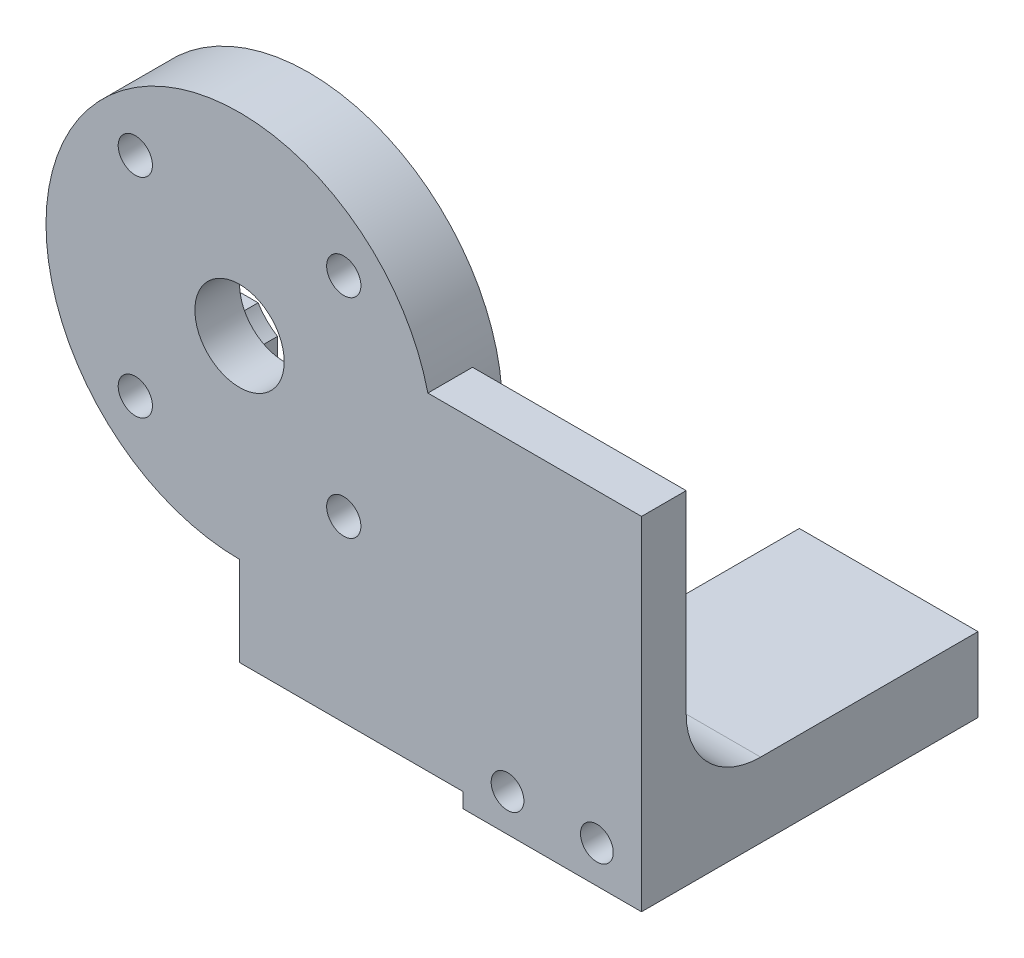
ISO-10303-21;
HEADER;
FILE_DESCRIPTION(('STEP AP214'),'2;1');
FILE_NAME('part.step','',(''),(''),'','','');
FILE_SCHEMA(('AUTOMOTIVE_DESIGN { 1 0 10303 214 1 1 1 1 }'));
ENDSEC;
DATA;
#1=APPLICATION_CONTEXT('core data for automotive mechanical design processes');
#2=APPLICATION_PROTOCOL_DEFINITION('international standard','automotive_design',2000,#1);
#3=PRODUCT_CONTEXT('',#1,'mechanical');
#4=PRODUCT('Part','Part','',(#3));
#5=PRODUCT_RELATED_PRODUCT_CATEGORY('part','',(#4));
#6=PRODUCT_DEFINITION_FORMATION('','',#4);
#7=PRODUCT_DEFINITION_CONTEXT('part definition',#1,'design');
#8=PRODUCT_DEFINITION('design','',#6,#7);
#9=PRODUCT_DEFINITION_SHAPE('','',#8);
#10=(LENGTH_UNIT() NAMED_UNIT(*) SI_UNIT(.MILLI.,.METRE.));
#11=(NAMED_UNIT(*) PLANE_ANGLE_UNIT() SI_UNIT($,.RADIAN.));
#12=(NAMED_UNIT(*) SI_UNIT($,.STERADIAN.) SOLID_ANGLE_UNIT());
#13=UNCERTAINTY_MEASURE_WITH_UNIT(LENGTH_MEASURE(1.E-05),#10,'distance_accuracy_value','');
#14=(GEOMETRIC_REPRESENTATION_CONTEXT(3) GLOBAL_UNCERTAINTY_ASSIGNED_CONTEXT((#13)) GLOBAL_UNIT_ASSIGNED_CONTEXT((#10,
#11,#12)) REPRESENTATION_CONTEXT('',''));
#15=CARTESIAN_POINT('',(0.,0.,0.));
#16=DIRECTION('',(0.,0.,1.));
#17=DIRECTION('',(1.,0.,0.));
#18=AXIS2_PLACEMENT_3D('',#15,#16,#17);
#19=CARTESIAN_POINT('',(0.,0.,17.95));
#20=DIRECTION('',(0.,0.,1.));
#21=DIRECTION('',(1.,0.,0.));
#22=AXIS2_PLACEMENT_3D('',#19,#20,#21);
#23=PLANE('',#22);
#24=CARTESIAN_POINT('',(7.,-7.,17.95));
#25=DIRECTION('',(0.,0.,1.));
#26=DIRECTION('',(1.,0.,0.));
#27=AXIS2_PLACEMENT_3D('',#24,#25,#26);
#28=CIRCLE('',#27,1.15);
#29=CARTESIAN_POINT('',(8.15,-7.,17.95));
#30=VERTEX_POINT('',#29);
#31=EDGE_CURVE('E786',#30,#30,#28,.F.);
#32=ORIENTED_EDGE('',*,*,#31,.F.);
#33=EDGE_LOOP('',(#32));
#34=FACE_BOUND('',#33,.T.);
#35=CARTESIAN_POINT('',(-7.,-7.,17.95));
#36=DIRECTION('',(0.,0.,1.));
#37=DIRECTION('',(1.,0.,0.));
#38=AXIS2_PLACEMENT_3D('',#35,#36,#37);
#39=CIRCLE('',#38,1.15);
#40=CARTESIAN_POINT('',(-5.85,-7.,17.95));
#41=VERTEX_POINT('',#40);
#42=EDGE_CURVE('E785',#41,#41,#39,.F.);
#43=ORIENTED_EDGE('',*,*,#42,.F.);
#44=EDGE_LOOP('',(#43));
#45=FACE_BOUND('',#44,.T.);
#46=CARTESIAN_POINT('',(-7.,7.,17.95));
#47=DIRECTION('',(0.,0.,1.));
#48=DIRECTION('',(1.,0.,0.));
#49=AXIS2_PLACEMENT_3D('',#46,#47,#48);
#50=CIRCLE('',#49,1.15);
#51=CARTESIAN_POINT('',(-5.85,7.,17.95));
#52=VERTEX_POINT('',#51);
#53=EDGE_CURVE('E773',#52,#52,#50,.F.);
#54=ORIENTED_EDGE('',*,*,#53,.F.);
#55=EDGE_LOOP('',(#54));
#56=FACE_BOUND('',#55,.T.);
#57=CARTESIAN_POINT('',(7.,7.,17.95));
#58=DIRECTION('',(0.,0.,1.));
#59=DIRECTION('',(1.,0.,0.));
#60=AXIS2_PLACEMENT_3D('',#57,#58,#59);
#61=CIRCLE('',#60,1.15);
#62=CARTESIAN_POINT('',(8.15,7.,17.95));
#63=VERTEX_POINT('',#62);
#64=EDGE_CURVE('E775',#63,#63,#61,.F.);
#65=ORIENTED_EDGE('',*,*,#64,.F.);
#66=EDGE_LOOP('',(#65));
#67=FACE_BOUND('',#66,.T.);
#68=CARTESIAN_POINT('',(0.,0.,17.95));
#69=DIRECTION('',(0.,0.,1.));
#70=DIRECTION('',(1.,0.,0.));
#71=AXIS2_PLACEMENT_3D('',#68,#69,#70);
#72=CIRCLE('',#71,13.);
#73=CARTESIAN_POINT('',(13.,0.,17.95));
#74=VERTEX_POINT('',#73);
#75=EDGE_CURVE('E266',#74,#74,#72,.T.);
#76=ORIENTED_EDGE('',*,*,#75,.F.);
#77=EDGE_LOOP('',(#76));
#78=FACE_BOUND('',#77,.T.);
#79=DIRECTION('',(-1.,0.,0.));
#80=VECTOR('',#79,1.);
#81=CARTESIAN_POINT('',(-8.15,2.1,17.95));
#82=LINE('',#81,#80);
#83=CARTESIAN_POINT('',(8.15,2.1,17.95));
#84=VERTEX_POINT('',#83);
#85=CARTESIAN_POINT('',(3.40440890610984,2.1,17.95));
#86=VERTEX_POINT('',#85);
#87=EDGE_CURVE('E234',#84,#86,#82,.T.);
#88=ORIENTED_EDGE('',*,*,#87,.T.);
#89=CARTESIAN_POINT('',(0.,0.,17.95));
#90=DIRECTION('',(0.,0.,1.));
#91=DIRECTION('',(1.,0.,0.));
#92=AXIS2_PLACEMENT_3D('',#89,#90,#91);
#93=CIRCLE('',#92,4.);
#94=CARTESIAN_POINT('',(2.1,3.40440890610984,17.95));
#95=VERTEX_POINT('',#94);
#96=EDGE_CURVE('E212',#86,#95,#93,.T.);
#97=ORIENTED_EDGE('',*,*,#96,.T.);
#98=DIRECTION('',(0.,1.,0.));
#99=VECTOR('',#98,1.);
#100=CARTESIAN_POINT('',(2.1,-8.15,17.95));
#101=LINE('',#100,#99);
#102=CARTESIAN_POINT('',(2.1,8.15,17.95));
#103=VERTEX_POINT('',#102);
#104=EDGE_CURVE('E817',#95,#103,#101,.T.);
#105=ORIENTED_EDGE('',*,*,#104,.T.);
#106=CARTESIAN_POINT('',(0.,8.15,17.95));
#107=DIRECTION('',(0.,0.,1.));
#108=DIRECTION('',(1.,0.,0.));
#109=AXIS2_PLACEMENT_3D('',#106,#107,#108);
#110=CIRCLE('',#109,2.1);
#111=CARTESIAN_POINT('',(-2.1,8.15,17.95));
#112=VERTEX_POINT('',#111);
#113=EDGE_CURVE('E799',#103,#112,#110,.T.);
#114=ORIENTED_EDGE('',*,*,#113,.T.);
#115=DIRECTION('',(0.,-1.,0.));
#116=VECTOR('',#115,1.);
#117=CARTESIAN_POINT('',(-2.1,-8.15,17.95));
#118=LINE('',#117,#116);
#119=CARTESIAN_POINT('',(-2.1,3.40440890610984,17.95));
#120=VERTEX_POINT('',#119);
#121=EDGE_CURVE('E820',#112,#120,#118,.T.);
#122=ORIENTED_EDGE('',*,*,#121,.T.);
#123=CARTESIAN_POINT('',(-3.40440890610984,2.1,17.95));
#124=VERTEX_POINT('',#123);
#125=EDGE_CURVE('E228',#120,#124,#93,.T.);
#126=ORIENTED_EDGE('',*,*,#125,.T.);
#127=CARTESIAN_POINT('',(-8.15,2.1,17.95));
#128=VERTEX_POINT('',#127);
#129=EDGE_CURVE('E242',#124,#128,#82,.T.);
#130=ORIENTED_EDGE('',*,*,#129,.T.);
#131=CARTESIAN_POINT('',(-8.15,0.,17.95));
#132=DIRECTION('',(0.,0.,1.));
#133=DIRECTION('',(1.,0.,0.));
#134=AXIS2_PLACEMENT_3D('',#131,#132,#133);
#135=CIRCLE('',#134,2.1);
#136=CARTESIAN_POINT('',(-8.15,-2.1,17.95));
#137=VERTEX_POINT('',#136);
#138=EDGE_CURVE('E794',#128,#137,#135,.T.);
#139=ORIENTED_EDGE('',*,*,#138,.T.);
#140=DIRECTION('',(1.,0.,0.));
#141=VECTOR('',#140,1.);
#142=CARTESIAN_POINT('',(-8.15,-2.1,17.95));
#143=LINE('',#142,#141);
#144=CARTESIAN_POINT('',(-3.40440890610984,-2.1,17.95));
#145=VERTEX_POINT('',#144);
#146=EDGE_CURVE('E247',#137,#145,#143,.T.);
#147=ORIENTED_EDGE('',*,*,#146,.T.);
#148=CARTESIAN_POINT('',(-2.1,-3.40440890610984,17.95));
#149=VERTEX_POINT('',#148);
#150=EDGE_CURVE('E853',#145,#149,#93,.T.);
#151=ORIENTED_EDGE('',*,*,#150,.T.);
#152=CARTESIAN_POINT('',(-2.1,-8.15,17.95));
#153=VERTEX_POINT('',#152);
#154=EDGE_CURVE('E795',#149,#153,#118,.T.);
#155=ORIENTED_EDGE('',*,*,#154,.T.);
#156=CARTESIAN_POINT('',(0.,-8.15,17.95));
#157=DIRECTION('',(0.,0.,1.));
#158=DIRECTION('',(1.,0.,0.));
#159=AXIS2_PLACEMENT_3D('',#156,#157,#158);
#160=CIRCLE('',#159,2.1);
#161=CARTESIAN_POINT('',(2.1,-8.15,17.95));
#162=VERTEX_POINT('',#161);
#163=EDGE_CURVE('E803',#153,#162,#160,.T.);
#164=ORIENTED_EDGE('',*,*,#163,.T.);
#165=CARTESIAN_POINT('',(2.1,-3.40440890610984,17.95));
#166=VERTEX_POINT('',#165);
#167=EDGE_CURVE('E821',#162,#166,#101,.T.);
#168=ORIENTED_EDGE('',*,*,#167,.T.);
#169=CARTESIAN_POINT('',(3.40440890610984,-2.1,17.95));
#170=VERTEX_POINT('',#169);
#171=EDGE_CURVE('E226',#166,#170,#93,.T.);
#172=ORIENTED_EDGE('',*,*,#171,.T.);
#173=CARTESIAN_POINT('',(8.15,-2.1,17.95));
#174=VERTEX_POINT('',#173);
#175=EDGE_CURVE('E835',#170,#174,#143,.T.);
#176=ORIENTED_EDGE('',*,*,#175,.T.);
#177=CARTESIAN_POINT('',(8.15,0.,17.95));
#178=DIRECTION('',(0.,0.,1.));
#179=DIRECTION('',(1.,0.,0.));
#180=AXIS2_PLACEMENT_3D('',#177,#178,#179);
#181=CIRCLE('',#180,2.1);
#182=EDGE_CURVE('E245',#174,#84,#181,.T.);
#183=ORIENTED_EDGE('',*,*,#182,.T.);
#184=EDGE_LOOP('',(#88,#97,#105,#114,#122,#126,#130,#139,#147,#151,#155,#164,#168,#172,#176,#183));
#185=FACE_BOUND('',#184,.T.);
#186=ADVANCED_FACE('F42',(#34,#45,#56,#67,#78,#185),#23,.F.);
#187=CARTESIAN_POINT('',(-8.15,-2.1,19.6));
#188=DIRECTION('',(0.,1.,0.));
#189=DIRECTION('',(0.,0.,1.));
#190=AXIS2_PLACEMENT_3D('',#187,#188,#189);
#191=PLANE('',#190);
#192=ORIENTED_EDGE('',*,*,#175,.F.);
#193=DIRECTION('',(0.,0.,-1.));
#194=VECTOR('',#193,1.);
#195=CARTESIAN_POINT('',(3.40440890610984,-2.1,19.6));
#196=LINE('',#195,#194);
#197=CARTESIAN_POINT('',(3.40440890610984,-2.1,19.6));
#198=VERTEX_POINT('',#197);
#199=EDGE_CURVE('E240',#170,#198,#196,.F.);
#200=ORIENTED_EDGE('',*,*,#199,.T.);
#201=DIRECTION('',(1.,0.,0.));
#202=VECTOR('',#201,1.);
#203=CARTESIAN_POINT('',(-8.15,-2.1,19.6));
#204=LINE('',#203,#202);
#205=CARTESIAN_POINT('',(8.15,-2.1,19.6));
#206=VERTEX_POINT('',#205);
#207=EDGE_CURVE('E243',#198,#206,#204,.T.);
#208=ORIENTED_EDGE('',*,*,#207,.T.);
#209=DIRECTION('',(0.,0.,-1.));
#210=VECTOR('',#209,1.);
#211=CARTESIAN_POINT('',(8.15,-2.1,19.6));
#212=LINE('',#211,#210);
#213=EDGE_CURVE('E260',#206,#174,#212,.T.);
#214=ORIENTED_EDGE('',*,*,#213,.T.);
#215=EDGE_LOOP('',(#192,#200,#208,#214));
#216=FACE_BOUND('',#215,.T.);
#217=ADVANCED_FACE('F401',(#216),#191,.T.);
#218=CARTESIAN_POINT('',(-8.15,2.1,19.6));
#219=DIRECTION('',(0.,-1.,0.));
#220=DIRECTION('',(0.,0.,-1.));
#221=AXIS2_PLACEMENT_3D('',#218,#219,#220);
#222=PLANE('',#221);
#223=DIRECTION('',(-1.,0.,0.));
#224=VECTOR('',#223,1.);
#225=CARTESIAN_POINT('',(-8.15,2.1,19.6));
#226=LINE('',#225,#224);
#227=CARTESIAN_POINT('',(8.15,2.1,19.6));
#228=VERTEX_POINT('',#227);
#229=CARTESIAN_POINT('',(3.40440890610984,2.1,19.6));
#230=VERTEX_POINT('',#229);
#231=EDGE_CURVE('E236',#228,#230,#226,.T.);
#232=ORIENTED_EDGE('',*,*,#231,.T.);
#233=DIRECTION('',(0.,0.,-1.));
#234=VECTOR('',#233,1.);
#235=CARTESIAN_POINT('',(3.40440890610984,2.1,19.6));
#236=LINE('',#235,#234);
#237=EDGE_CURVE('E220',#230,#86,#236,.T.);
#238=ORIENTED_EDGE('',*,*,#237,.T.);
#239=ORIENTED_EDGE('',*,*,#87,.F.);
#240=DIRECTION('',(0.,0.,-1.));
#241=VECTOR('',#240,1.);
#242=CARTESIAN_POINT('',(8.15,2.1,19.6));
#243=LINE('',#242,#241);
#244=EDGE_CURVE('E253',#228,#84,#243,.T.);
#245=ORIENTED_EDGE('',*,*,#244,.F.);
#246=EDGE_LOOP('',(#232,#238,#239,#245));
#247=FACE_BOUND('',#246,.T.);
#248=ADVANCED_FACE('F235',(#247),#222,.T.);
#249=ORIENTED_EDGE('',*,*,#129,.F.);
#250=DIRECTION('',(0.,0.,-1.));
#251=VECTOR('',#250,1.);
#252=CARTESIAN_POINT('',(-3.40440890610984,2.1,19.6));
#253=LINE('',#252,#251);
#254=CARTESIAN_POINT('',(-3.40440890610984,2.1,19.6));
#255=VERTEX_POINT('',#254);
#256=EDGE_CURVE('E238',#124,#255,#253,.F.);
#257=ORIENTED_EDGE('',*,*,#256,.T.);
#258=CARTESIAN_POINT('',(-8.15,2.1,19.6));
#259=VERTEX_POINT('',#258);
#260=EDGE_CURVE('E833',#255,#259,#226,.T.);
#261=ORIENTED_EDGE('',*,*,#260,.T.);
#262=DIRECTION('',(0.,0.,-1.));
#263=VECTOR('',#262,1.);
#264=CARTESIAN_POINT('',(-8.15,2.1,19.6));
#265=LINE('',#264,#263);
#266=EDGE_CURVE('E255',#259,#128,#265,.T.);
#267=ORIENTED_EDGE('',*,*,#266,.T.);
#268=EDGE_LOOP('',(#249,#257,#261,#267));
#269=FACE_BOUND('',#268,.T.);
#270=ADVANCED_FACE('F529',(#269),#222,.T.);
#271=CARTESIAN_POINT('',(-8.15,-2.1,19.6));
#272=VERTEX_POINT('',#271);
#273=CARTESIAN_POINT('',(-3.40440890610984,-2.1,19.6));
#274=VERTEX_POINT('',#273);
#275=EDGE_CURVE('E246',#272,#274,#204,.T.);
#276=ORIENTED_EDGE('',*,*,#275,.T.);
#277=DIRECTION('',(0.,0.,-1.));
#278=VECTOR('',#277,1.);
#279=CARTESIAN_POINT('',(-3.40440890610984,-2.1,19.6));
#280=LINE('',#279,#278);
#281=EDGE_CURVE('E862',#274,#145,#280,.T.);
#282=ORIENTED_EDGE('',*,*,#281,.T.);
#283=ORIENTED_EDGE('',*,*,#146,.F.);
#284=DIRECTION('',(0.,0.,-1.));
#285=VECTOR('',#284,1.);
#286=CARTESIAN_POINT('',(-8.15,-2.1,19.6));
#287=LINE('',#286,#285);
#288=EDGE_CURVE('E257',#272,#137,#287,.T.);
#289=ORIENTED_EDGE('',*,*,#288,.F.);
#290=EDGE_LOOP('',(#276,#282,#283,#289));
#291=FACE_BOUND('',#290,.T.);
#292=ADVANCED_FACE('F411',(#291),#191,.T.);
#293=CARTESIAN_POINT('',(2.1,-8.15,19.6));
#294=DIRECTION('',(-1.,0.,0.));
#295=DIRECTION('',(0.,0.,1.));
#296=AXIS2_PLACEMENT_3D('',#293,#294,#295);
#297=PLANE('',#296);
#298=ORIENTED_EDGE('',*,*,#104,.F.);
#299=DIRECTION('',(0.,0.,-1.));
#300=VECTOR('',#299,1.);
#301=CARTESIAN_POINT('',(2.1,3.40440890610984,19.6));
#302=LINE('',#301,#300);
#303=CARTESIAN_POINT('',(2.1,3.40440890610984,19.6));
#304=VERTEX_POINT('',#303);
#305=EDGE_CURVE('E221',#95,#304,#302,.F.);
#306=ORIENTED_EDGE('',*,*,#305,.T.);
#307=DIRECTION('',(0.,1.,0.));
#308=VECTOR('',#307,1.);
#309=CARTESIAN_POINT('',(2.1,-8.15,19.6));
#310=LINE('',#309,#308);
#311=CARTESIAN_POINT('',(2.1,8.15,19.6));
#312=VERTEX_POINT('',#311);
#313=EDGE_CURVE('E813',#304,#312,#310,.T.);
#314=ORIENTED_EDGE('',*,*,#313,.T.);
#315=DIRECTION('',(0.,0.,-1.));
#316=VECTOR('',#315,1.);
#317=CARTESIAN_POINT('',(2.1,8.15,19.6));
#318=LINE('',#317,#316);
#319=EDGE_CURVE('E824',#312,#103,#318,.T.);
#320=ORIENTED_EDGE('',*,*,#319,.T.);
#321=EDGE_LOOP('',(#298,#306,#314,#320));
#322=FACE_BOUND('',#321,.T.);
#323=ADVANCED_FACE('F545',(#322),#297,.T.);
#324=CARTESIAN_POINT('',(-2.1,-8.15,19.6));
#325=DIRECTION('',(1.,0.,0.));
#326=DIRECTION('',(0.,0.,-1.));
#327=AXIS2_PLACEMENT_3D('',#324,#325,#326);
#328=PLANE('',#327);
#329=DIRECTION('',(0.,-1.,0.));
#330=VECTOR('',#329,1.);
#331=CARTESIAN_POINT('',(-2.1,-8.15,19.6));
#332=LINE('',#331,#330);
#333=CARTESIAN_POINT('',(-2.1,8.15,19.6));
#334=VERTEX_POINT('',#333);
#335=CARTESIAN_POINT('',(-2.1,3.40440890610984,19.6));
#336=VERTEX_POINT('',#335);
#337=EDGE_CURVE('E807',#334,#336,#332,.T.);
#338=ORIENTED_EDGE('',*,*,#337,.T.);
#339=DIRECTION('',(0.,0.,-1.));
#340=VECTOR('',#339,1.);
#341=CARTESIAN_POINT('',(-2.1,3.40440890610984,19.6));
#342=LINE('',#341,#340);
#343=EDGE_CURVE('E865',#336,#120,#342,.T.);
#344=ORIENTED_EDGE('',*,*,#343,.T.);
#345=ORIENTED_EDGE('',*,*,#121,.F.);
#346=DIRECTION('',(0.,0.,-1.));
#347=VECTOR('',#346,1.);
#348=CARTESIAN_POINT('',(-2.1,8.15,19.6));
#349=LINE('',#348,#347);
#350=EDGE_CURVE('E818',#334,#112,#349,.T.);
#351=ORIENTED_EDGE('',*,*,#350,.F.);
#352=EDGE_LOOP('',(#338,#344,#345,#351));
#353=FACE_BOUND('',#352,.T.);
#354=ADVANCED_FACE('F553',(#353),#328,.T.);
#355=ORIENTED_EDGE('',*,*,#154,.F.);
#356=DIRECTION('',(0.,0.,-1.));
#357=VECTOR('',#356,1.);
#358=CARTESIAN_POINT('',(-2.1,-3.40440890610984,19.6));
#359=LINE('',#358,#357);
#360=CARTESIAN_POINT('',(-2.1,-3.40440890610984,19.6));
#361=VERTEX_POINT('',#360);
#362=EDGE_CURVE('E859',#149,#361,#359,.F.);
#363=ORIENTED_EDGE('',*,*,#362,.T.);
#364=CARTESIAN_POINT('',(-2.1,-8.15,19.6));
#365=VERTEX_POINT('',#364);
#366=EDGE_CURVE('E812',#361,#365,#332,.T.);
#367=ORIENTED_EDGE('',*,*,#366,.T.);
#368=DIRECTION('',(0.,0.,-1.));
#369=VECTOR('',#368,1.);
#370=CARTESIAN_POINT('',(-2.1,-8.15,19.6));
#371=LINE('',#370,#369);
#372=EDGE_CURVE('E829',#365,#153,#371,.T.);
#373=ORIENTED_EDGE('',*,*,#372,.T.);
#374=EDGE_LOOP('',(#355,#363,#367,#373));
#375=FACE_BOUND('',#374,.T.);
#376=ADVANCED_FACE('F561',(#375),#328,.T.);
#377=CARTESIAN_POINT('',(2.1,-8.15,19.6));
#378=VERTEX_POINT('',#377);
#379=CARTESIAN_POINT('',(2.1,-3.40440890610984,19.6));
#380=VERTEX_POINT('',#379);
#381=EDGE_CURVE('E811',#378,#380,#310,.T.);
#382=ORIENTED_EDGE('',*,*,#381,.T.);
#383=DIRECTION('',(0.,0.,-1.));
#384=VECTOR('',#383,1.);
#385=CARTESIAN_POINT('',(2.1,-3.40440890610984,19.6));
#386=LINE('',#385,#384);
#387=EDGE_CURVE('E337',#380,#166,#386,.T.);
#388=ORIENTED_EDGE('',*,*,#387,.T.);
#389=ORIENTED_EDGE('',*,*,#167,.F.);
#390=DIRECTION('',(0.,0.,-1.));
#391=VECTOR('',#390,1.);
#392=CARTESIAN_POINT('',(2.1,-8.15,19.6));
#393=LINE('',#392,#391);
#394=EDGE_CURVE('E828',#378,#162,#393,.T.);
#395=ORIENTED_EDGE('',*,*,#394,.F.);
#396=EDGE_LOOP('',(#382,#388,#389,#395));
#397=FACE_BOUND('',#396,.T.);
#398=ADVANCED_FACE('F555',(#397),#297,.T.);
#399=CARTESIAN_POINT('',(0.,0.,19.6));
#400=DIRECTION('',(0.,0.,1.));
#401=DIRECTION('',(1.,0.,0.));
#402=AXIS2_PLACEMENT_3D('',#399,#400,#401);
#403=PLANE('',#402);
#404=DIRECTION('',(0.,1.,0.));
#405=VECTOR('',#404,1.);
#406=CARTESIAN_POINT('',(27.,-19.,19.6));
#407=LINE('',#406,#405);
#408=CARTESIAN_POINT('',(27.,-10.,19.6));
#409=VERTEX_POINT('',#408);
#410=CARTESIAN_POINT('',(27.,3.,19.6));
#411=VERTEX_POINT('',#410);
#412=EDGE_CURVE('E317',#409,#411,#407,.T.);
#413=ORIENTED_EDGE('',*,*,#412,.F.);
#414=DIRECTION('',(1.,0.,0.));
#415=VECTOR('',#414,1.);
#416=CARTESIAN_POINT('',(15.,-10.,19.6));
#417=LINE('',#416,#415);
#418=CARTESIAN_POINT('',(15.,-10.,19.6));
#419=VERTEX_POINT('',#418);
#420=EDGE_CURVE('E348',#409,#419,#417,.F.);
#421=ORIENTED_EDGE('',*,*,#420,.T.);
#422=DIRECTION('',(0.,1.,0.));
#423=VECTOR('',#422,1.);
#424=CARTESIAN_POINT('',(15.,0.,19.6));
#425=LINE('',#424,#423);
#426=CARTESIAN_POINT('',(15.,-19.,19.6));
#427=VERTEX_POINT('',#426);
#428=EDGE_CURVE('E59',#427,#419,#425,.T.);
#429=ORIENTED_EDGE('',*,*,#428,.F.);
#430=DIRECTION('',(1.,0.,0.));
#431=VECTOR('',#430,1.);
#432=CARTESIAN_POINT('',(0.,-19.,19.6));
#433=LINE('',#432,#431);
#434=CARTESIAN_POINT('',(0.,-19.,19.6));
#435=VERTEX_POINT('',#434);
#436=EDGE_CURVE('E313',#435,#427,#433,.T.);
#437=ORIENTED_EDGE('',*,*,#436,.F.);
#438=DIRECTION('',(0.,-1.,0.));
#439=VECTOR('',#438,1.);
#440=CARTESIAN_POINT('',(0.,-19.,19.6));
#441=LINE('',#440,#439);
#442=CARTESIAN_POINT('',(0.,-13.,19.6));
#443=VERTEX_POINT('',#442);
#444=EDGE_CURVE('E297',#443,#435,#441,.T.);
#445=ORIENTED_EDGE('',*,*,#444,.F.);
#446=CARTESIAN_POINT('',(0.,0.,19.6));
#447=DIRECTION('',(0.,0.,1.));
#448=DIRECTION('',(1.,0.,0.));
#449=AXIS2_PLACEMENT_3D('',#446,#447,#448);
#450=CIRCLE('',#449,13.);
#451=CARTESIAN_POINT('',(12.6491106406735,3.,19.6));
#452=VERTEX_POINT('',#451);
#453=EDGE_CURVE('E265',#443,#452,#450,.T.);
#454=ORIENTED_EDGE('',*,*,#453,.T.);
#455=DIRECTION('',(-1.,0.,0.));
#456=VECTOR('',#455,1.);
#457=CARTESIAN_POINT('',(0.,3.,19.6));
#458=LINE('',#457,#456);
#459=EDGE_CURVE('E302',#411,#452,#458,.T.);
#460=ORIENTED_EDGE('',*,*,#459,.F.);
#461=EDGE_LOOP('',(#413,#421,#429,#437,#445,#454,#460));
#462=FACE_BOUND('',#461,.T.);
#463=ADVANCED_FACE('F352',(#462),#403,.F.);
#464=CARTESIAN_POINT('',(0.,-19.,22.6));
#465=DIRECTION('',(0.,1.,0.));
#466=DIRECTION('',(0.,0.,1.));
#467=AXIS2_PLACEMENT_3D('',#464,#465,#466);
#468=PLANE('',#467);
#469=DIRECTION('',(0.,0.,-1.));
#470=VECTOR('',#469,1.);
#471=CARTESIAN_POINT('',(15.,-19.,22.6));
#472=LINE('',#471,#470);
#473=CARTESIAN_POINT('',(15.,-19.,22.6));
#474=VERTEX_POINT('',#473);
#475=EDGE_CURVE('E333',#474,#427,#472,.T.);
#476=ORIENTED_EDGE('',*,*,#475,.F.);
#477=DIRECTION('',(1.,0.,0.));
#478=VECTOR('',#477,1.);
#479=CARTESIAN_POINT('',(0.,-19.,22.6));
#480=LINE('',#479,#478);
#481=CARTESIAN_POINT('',(0.,-19.,22.6));
#482=VERTEX_POINT('',#481);
#483=EDGE_CURVE('E303',#482,#474,#480,.T.);
#484=ORIENTED_EDGE('',*,*,#483,.F.);
#485=DIRECTION('',(0.,0.,-1.));
#486=VECTOR('',#485,1.);
#487=CARTESIAN_POINT('',(0.,-19.,22.6));
#488=LINE('',#487,#486);
#489=EDGE_CURVE('E325',#482,#435,#488,.T.);
#490=ORIENTED_EDGE('',*,*,#489,.T.);
#491=ORIENTED_EDGE('',*,*,#436,.T.);
#492=EDGE_LOOP('',(#476,#484,#490,#491));
#493=FACE_BOUND('',#492,.T.);
#494=ADVANCED_FACE('F379',(#493),#468,.F.);
#495=CARTESIAN_POINT('',(0.,0.,22.6));
#496=DIRECTION('',(0.,0.,-1.));
#497=DIRECTION('',(-1.,0.,0.));
#498=AXIS2_PLACEMENT_3D('',#495,#496,#497);
#499=CYLINDRICAL_SURFACE('',#498,13.);
#500=DIRECTION('',(0.,0.,-1.));
#501=VECTOR('',#500,1.);
#502=CARTESIAN_POINT('',(0.,-13.,22.6));
#503=LINE('',#502,#501);
#504=CARTESIAN_POINT('',(0.,-13.,22.6));
#505=VERTEX_POINT('',#504);
#506=EDGE_CURVE('E331',#505,#443,#503,.T.);
#507=ORIENTED_EDGE('',*,*,#506,.F.);
#508=CARTESIAN_POINT('',(0.,0.,22.6));
#509=DIRECTION('',(0.,0.,1.));
#510=DIRECTION('',(1.,0.,0.));
#511=AXIS2_PLACEMENT_3D('',#508,#509,#510);
#512=CIRCLE('',#511,13.);
#513=CARTESIAN_POINT('',(12.6491106406735,3.,22.6));
#514=VERTEX_POINT('',#513);
#515=EDGE_CURVE('E330',#514,#505,#512,.T.);
#516=ORIENTED_EDGE('',*,*,#515,.F.);
#517=DIRECTION('',(0.,0.,-1.));
#518=VECTOR('',#517,1.);
#519=CARTESIAN_POINT('',(12.6491106406735,3.,22.6));
#520=LINE('',#519,#518);
#521=EDGE_CURVE('E322',#452,#514,#520,.F.);
#522=ORIENTED_EDGE('',*,*,#521,.F.);
#523=ORIENTED_EDGE('',*,*,#453,.F.);
#524=EDGE_LOOP('',(#507,#516,#522,#523));
#525=FACE_BOUND('',#524,.T.);
#526=ORIENTED_EDGE('',*,*,#75,.T.);
#527=EDGE_LOOP('',(#526));
#528=FACE_BOUND('',#527,.T.);
#529=ADVANCED_FACE('F388',(#525,#528),#499,.T.);
#530=CARTESIAN_POINT('',(0.,0.,22.6));
#531=DIRECTION('',(0.,0.,1.));
#532=DIRECTION('',(1.,0.,0.));
#533=AXIS2_PLACEMENT_3D('',#530,#531,#532);
#534=PLANE('',#533);
#535=CARTESIAN_POINT('',(18.,-17.5,22.6));
#536=DIRECTION('',(0.,0.,1.));
#537=DIRECTION('',(1.,0.,0.));
#538=AXIS2_PLACEMENT_3D('',#535,#536,#537);
#539=CIRCLE('',#538,1.1);
#540=CARTESIAN_POINT('',(19.1,-17.5,22.6));
#541=VERTEX_POINT('',#540);
#542=EDGE_CURVE('E344',#541,#541,#539,.T.);
#543=ORIENTED_EDGE('',*,*,#542,.F.);
#544=EDGE_LOOP('',(#543));
#545=FACE_BOUND('',#544,.T.);
#546=CARTESIAN_POINT('',(24.,-17.5,22.6));
#547=DIRECTION('',(0.,0.,1.));
#548=DIRECTION('',(1.,0.,0.));
#549=AXIS2_PLACEMENT_3D('',#546,#547,#548);
#550=CIRCLE('',#549,1.1);
#551=CARTESIAN_POINT('',(25.1,-17.5,22.6));
#552=VERTEX_POINT('',#551);
#553=EDGE_CURVE('E753',#552,#552,#550,.T.);
#554=ORIENTED_EDGE('',*,*,#553,.F.);
#555=EDGE_LOOP('',(#554));
#556=FACE_BOUND('',#555,.T.);
#557=CARTESIAN_POINT('',(7.,-7.,22.6));
#558=DIRECTION('',(0.,0.,1.));
#559=DIRECTION('',(1.,0.,0.));
#560=AXIS2_PLACEMENT_3D('',#557,#558,#559);
#561=CIRCLE('',#560,1.15);
#562=CARTESIAN_POINT('',(8.15,-7.,22.6));
#563=VERTEX_POINT('',#562);
#564=EDGE_CURVE('E752',#563,#563,#561,.T.);
#565=ORIENTED_EDGE('',*,*,#564,.F.);
#566=EDGE_LOOP('',(#565));
#567=FACE_BOUND('',#566,.T.);
#568=CARTESIAN_POINT('',(-7.,-7.,22.6));
#569=DIRECTION('',(0.,0.,1.));
#570=DIRECTION('',(1.,0.,0.));
#571=AXIS2_PLACEMENT_3D('',#568,#569,#570);
#572=CIRCLE('',#571,1.15);
#573=CARTESIAN_POINT('',(-5.85,-7.,22.6));
#574=VERTEX_POINT('',#573);
#575=EDGE_CURVE('E757',#574,#574,#572,.T.);
#576=ORIENTED_EDGE('',*,*,#575,.F.);
#577=EDGE_LOOP('',(#576));
#578=FACE_BOUND('',#577,.T.);
#579=CARTESIAN_POINT('',(-7.,7.,22.6));
#580=DIRECTION('',(0.,0.,1.));
#581=DIRECTION('',(1.,0.,0.));
#582=AXIS2_PLACEMENT_3D('',#579,#580,#581);
#583=CIRCLE('',#582,1.15);
#584=CARTESIAN_POINT('',(-5.85,7.,22.6));
#585=VERTEX_POINT('',#584);
#586=EDGE_CURVE('E763',#585,#585,#583,.T.);
#587=ORIENTED_EDGE('',*,*,#586,.F.);
#588=EDGE_LOOP('',(#587));
#589=FACE_BOUND('',#588,.T.);
#590=CARTESIAN_POINT('',(7.,7.,22.6));
#591=DIRECTION('',(0.,0.,1.));
#592=DIRECTION('',(1.,0.,0.));
#593=AXIS2_PLACEMENT_3D('',#590,#591,#592);
#594=CIRCLE('',#593,1.15);
#595=CARTESIAN_POINT('',(8.15,7.,22.6));
#596=VERTEX_POINT('',#595);
#597=EDGE_CURVE('E770',#596,#596,#594,.T.);
#598=ORIENTED_EDGE('',*,*,#597,.F.);
#599=EDGE_LOOP('',(#598));
#600=FACE_BOUND('',#599,.T.);
#601=CARTESIAN_POINT('',(0.,0.,22.6));
#602=DIRECTION('',(0.,0.,1.));
#603=DIRECTION('',(1.,0.,0.));
#604=AXIS2_PLACEMENT_3D('',#601,#602,#603);
#605=CIRCLE('',#604,3.);
#606=CARTESIAN_POINT('',(3.,0.,22.6));
#607=VERTEX_POINT('',#606);
#608=EDGE_CURVE('E262',#607,#607,#605,.T.);
#609=ORIENTED_EDGE('',*,*,#608,.F.);
#610=EDGE_LOOP('',(#609));
#611=FACE_BOUND('',#610,.T.);
#612=ORIENTED_EDGE('',*,*,#483,.T.);
#613=DIRECTION('',(0.,-1.,0.));
#614=VECTOR('',#613,1.);
#615=CARTESIAN_POINT('',(15.,-20.,22.6));
#616=LINE('',#615,#614);
#617=CARTESIAN_POINT('',(15.,-20.,22.6));
#618=VERTEX_POINT('',#617);
#619=EDGE_CURVE('E274',#474,#618,#616,.T.);
#620=ORIENTED_EDGE('',*,*,#619,.T.);
#621=DIRECTION('',(1.,0.,0.));
#622=VECTOR('',#621,1.);
#623=CARTESIAN_POINT('',(15.,-20.,22.6));
#624=LINE('',#623,#622);
#625=CARTESIAN_POINT('',(27.,-20.,22.6));
#626=VERTEX_POINT('',#625);
#627=EDGE_CURVE('E278',#618,#626,#624,.T.);
#628=ORIENTED_EDGE('',*,*,#627,.T.);
#629=DIRECTION('',(0.,1.,0.));
#630=VECTOR('',#629,1.);
#631=CARTESIAN_POINT('',(27.,-19.,22.6));
#632=LINE('',#631,#630);
#633=CARTESIAN_POINT('',(27.,3.,22.6));
#634=VERTEX_POINT('',#633);
#635=EDGE_CURVE('E310',#626,#634,#632,.T.);
#636=ORIENTED_EDGE('',*,*,#635,.T.);
#637=DIRECTION('',(-1.,0.,0.));
#638=VECTOR('',#637,1.);
#639=CARTESIAN_POINT('',(0.,3.,22.6));
#640=LINE('',#639,#638);
#641=EDGE_CURVE('E307',#634,#514,#640,.T.);
#642=ORIENTED_EDGE('',*,*,#641,.T.);
#643=ORIENTED_EDGE('',*,*,#515,.T.);
#644=DIRECTION('',(0.,-1.,0.));
#645=VECTOR('',#644,1.);
#646=CARTESIAN_POINT('',(0.,-19.,22.6));
#647=LINE('',#646,#645);
#648=EDGE_CURVE('E301',#505,#482,#647,.T.);
#649=ORIENTED_EDGE('',*,*,#648,.T.);
#650=EDGE_LOOP('',(#612,#620,#628,#636,#642,#643,#649));
#651=FACE_BOUND('',#650,.T.);
#652=ADVANCED_FACE('F372',(#545,#556,#567,#578,#589,#600,#611,#651),#534,.T.);
#653=CARTESIAN_POINT('',(0.,-19.,22.6));
#654=DIRECTION('',(1.,0.,0.));
#655=DIRECTION('',(0.,0.,-1.));
#656=AXIS2_PLACEMENT_3D('',#653,#654,#655);
#657=PLANE('',#656);
#658=ORIENTED_EDGE('',*,*,#648,.F.);
#659=ORIENTED_EDGE('',*,*,#506,.T.);
#660=ORIENTED_EDGE('',*,*,#444,.T.);
#661=ORIENTED_EDGE('',*,*,#489,.F.);
#662=EDGE_LOOP('',(#658,#659,#660,#661));
#663=FACE_BOUND('',#662,.T.);
#664=ADVANCED_FACE('F385',(#663),#657,.F.);
#665=CARTESIAN_POINT('',(0.,3.,22.6));
#666=DIRECTION('',(0.,-1.,0.));
#667=DIRECTION('',(0.,0.,-1.));
#668=AXIS2_PLACEMENT_3D('',#665,#666,#667);
#669=PLANE('',#668);
#670=ORIENTED_EDGE('',*,*,#459,.T.);
#671=ORIENTED_EDGE('',*,*,#521,.T.);
#672=ORIENTED_EDGE('',*,*,#641,.F.);
#673=DIRECTION('',(0.,0.,-1.));
#674=VECTOR('',#673,1.);
#675=CARTESIAN_POINT('',(27.,3.,22.6));
#676=LINE('',#675,#674);
#677=EDGE_CURVE('E315',#634,#411,#676,.T.);
#678=ORIENTED_EDGE('',*,*,#677,.T.);
#679=EDGE_LOOP('',(#670,#671,#672,#678));
#680=FACE_BOUND('',#679,.T.);
#681=ADVANCED_FACE('F387',(#680),#669,.F.);
#682=CARTESIAN_POINT('',(27.,-19.,22.6));
#683=DIRECTION('',(-1.,0.,0.));
#684=DIRECTION('',(0.,0.,1.));
#685=AXIS2_PLACEMENT_3D('',#682,#683,#684);
#686=PLANE('',#685);
#687=DIRECTION('',(0.,0.,-1.));
#688=VECTOR('',#687,1.);
#689=CARTESIAN_POINT('',(27.,-15.,22.6));
#690=LINE('',#689,#688);
#691=CARTESIAN_POINT('',(27.,-15.,14.6));
#692=VERTEX_POINT('',#691);
#693=CARTESIAN_POINT('',(27.,-15.,0.));
#694=VERTEX_POINT('',#693);
#695=EDGE_CURVE('E293',#692,#694,#690,.T.);
#696=ORIENTED_EDGE('',*,*,#695,.F.);
#697=CARTESIAN_POINT('',(27.,-10.,14.6));
#698=DIRECTION('',(-1.,0.,0.));
#699=DIRECTION('',(0.,0.,1.));
#700=AXIS2_PLACEMENT_3D('',#697,#698,#699);
#701=CIRCLE('',#700,5.);
#702=EDGE_CURVE('E55',#692,#409,#701,.T.);
#703=ORIENTED_EDGE('',*,*,#702,.T.);
#704=ORIENTED_EDGE('',*,*,#412,.T.);
#705=ORIENTED_EDGE('',*,*,#677,.F.);
#706=ORIENTED_EDGE('',*,*,#635,.F.);
#707=DIRECTION('',(0.,0.,-1.));
#708=VECTOR('',#707,1.);
#709=CARTESIAN_POINT('',(27.,-20.,22.6));
#710=LINE('',#709,#708);
#711=CARTESIAN_POINT('',(27.,-20.,0.));
#712=VERTEX_POINT('',#711);
#713=EDGE_CURVE('E291',#626,#712,#710,.T.);
#714=ORIENTED_EDGE('',*,*,#713,.T.);
#715=DIRECTION('',(0.,1.,0.));
#716=VECTOR('',#715,1.);
#717=CARTESIAN_POINT('',(27.,-20.,0.));
#718=LINE('',#717,#716);
#719=EDGE_CURVE('E282',#712,#694,#718,.T.);
#720=ORIENTED_EDGE('',*,*,#719,.T.);
#721=EDGE_LOOP('',(#696,#703,#704,#705,#706,#714,#720));
#722=FACE_BOUND('',#721,.T.);
#723=ADVANCED_FACE('F394',(#722),#686,.F.);
#724=CARTESIAN_POINT('',(15.,-15.,22.6));
#725=DIRECTION('',(0.,-1.,0.));
#726=DIRECTION('',(0.,0.,-1.));
#727=AXIS2_PLACEMENT_3D('',#724,#725,#726);
#728=PLANE('',#727);
#729=DIRECTION('',(0.,0.,-1.));
#730=VECTOR('',#729,1.);
#731=CARTESIAN_POINT('',(15.,-15.,22.6));
#732=LINE('',#731,#730);
#733=CARTESIAN_POINT('',(15.,-15.,14.6));
#734=VERTEX_POINT('',#733);
#735=CARTESIAN_POINT('',(15.,-15.,0.));
#736=VERTEX_POINT('',#735);
#737=EDGE_CURVE('E277',#734,#736,#732,.T.);
#738=ORIENTED_EDGE('',*,*,#737,.F.);
#739=DIRECTION('',(1.,0.,0.));
#740=VECTOR('',#739,1.);
#741=CARTESIAN_POINT('',(27.,-15.,14.6));
#742=LINE('',#741,#740);
#743=EDGE_CURVE('E339',#734,#692,#742,.T.);
#744=ORIENTED_EDGE('',*,*,#743,.T.);
#745=ORIENTED_EDGE('',*,*,#695,.T.);
#746=DIRECTION('',(-1.,0.,0.));
#747=VECTOR('',#746,1.);
#748=CARTESIAN_POINT('',(15.,-15.,0.));
#749=LINE('',#748,#747);
#750=EDGE_CURVE('E280',#694,#736,#749,.T.);
#751=ORIENTED_EDGE('',*,*,#750,.T.);
#752=EDGE_LOOP('',(#738,#744,#745,#751));
#753=FACE_BOUND('',#752,.T.);
#754=ADVANCED_FACE('F363',(#753),#728,.F.);
#755=CARTESIAN_POINT('',(15.,-20.,22.6));
#756=DIRECTION('',(1.,0.,0.));
#757=DIRECTION('',(0.,0.,-1.));
#758=AXIS2_PLACEMENT_3D('',#755,#756,#757);
#759=PLANE('',#758);
#760=ORIENTED_EDGE('',*,*,#475,.T.);
#761=ORIENTED_EDGE('',*,*,#428,.T.);
#762=CARTESIAN_POINT('',(15.,-10.,14.6));
#763=DIRECTION('',(1.,0.,0.));
#764=DIRECTION('',(0.,0.,-1.));
#765=AXIS2_PLACEMENT_3D('',#762,#763,#764);
#766=CIRCLE('',#765,5.);
#767=EDGE_CURVE('E11',#419,#734,#766,.T.);
#768=ORIENTED_EDGE('',*,*,#767,.T.);
#769=ORIENTED_EDGE('',*,*,#737,.T.);
#770=DIRECTION('',(0.,-1.,0.));
#771=VECTOR('',#770,1.);
#772=CARTESIAN_POINT('',(15.,-20.,0.));
#773=LINE('',#772,#771);
#774=CARTESIAN_POINT('',(15.,-20.,0.));
#775=VERTEX_POINT('',#774);
#776=EDGE_CURVE('E271',#736,#775,#773,.T.);
#777=ORIENTED_EDGE('',*,*,#776,.T.);
#778=DIRECTION('',(0.,0.,-1.));
#779=VECTOR('',#778,1.);
#780=CARTESIAN_POINT('',(15.,-20.,22.6));
#781=LINE('',#780,#779);
#782=EDGE_CURVE('E298',#618,#775,#781,.T.);
#783=ORIENTED_EDGE('',*,*,#782,.F.);
#784=ORIENTED_EDGE('',*,*,#619,.F.);
#785=EDGE_LOOP('',(#760,#761,#768,#769,#777,#783,#784));
#786=FACE_BOUND('',#785,.T.);
#787=ADVANCED_FACE('F360',(#786),#759,.F.);
#788=CARTESIAN_POINT('',(15.,-20.,22.6));
#789=DIRECTION('',(0.,1.,0.));
#790=DIRECTION('',(0.,0.,1.));
#791=AXIS2_PLACEMENT_3D('',#788,#789,#790);
#792=PLANE('',#791);
#793=DIRECTION('',(1.,0.,0.));
#794=VECTOR('',#793,1.);
#795=CARTESIAN_POINT('',(15.,-20.,0.));
#796=LINE('',#795,#794);
#797=EDGE_CURVE('E285',#775,#712,#796,.T.);
#798=ORIENTED_EDGE('',*,*,#797,.T.);
#799=ORIENTED_EDGE('',*,*,#713,.F.);
#800=ORIENTED_EDGE('',*,*,#627,.F.);
#801=ORIENTED_EDGE('',*,*,#782,.T.);
#802=EDGE_LOOP('',(#798,#799,#800,#801));
#803=FACE_BOUND('',#802,.T.);
#804=ADVANCED_FACE('F371',(#803),#792,.F.);
#805=CARTESIAN_POINT('',(0.,0.,0.));
#806=DIRECTION('',(0.,0.,-1.));
#807=DIRECTION('',(-1.,0.,0.));
#808=AXIS2_PLACEMENT_3D('',#805,#806,#807);
#809=PLANE('',#808);
#810=CARTESIAN_POINT('',(18.,-17.5,0.));
#811=DIRECTION('',(0.,0.,-1.));
#812=DIRECTION('',(-1.,0.,0.));
#813=AXIS2_PLACEMENT_3D('',#810,#811,#812);
#814=CIRCLE('',#813,1.1);
#815=CARTESIAN_POINT('',(16.9,-17.5,0.));
#816=VERTEX_POINT('',#815);
#817=EDGE_CURVE('E341',#816,#816,#814,.F.);
#818=ORIENTED_EDGE('',*,*,#817,.T.);
#819=EDGE_LOOP('',(#818));
#820=FACE_BOUND('',#819,.T.);
#821=CARTESIAN_POINT('',(24.,-17.5,0.));
#822=DIRECTION('',(0.,0.,-1.));
#823=DIRECTION('',(-1.,0.,0.));
#824=AXIS2_PLACEMENT_3D('',#821,#822,#823);
#825=CIRCLE('',#824,1.1);
#826=CARTESIAN_POINT('',(22.9,-17.5,0.));
#827=VERTEX_POINT('',#826);
#828=EDGE_CURVE('E338',#827,#827,#825,.F.);
#829=ORIENTED_EDGE('',*,*,#828,.T.);
#830=EDGE_LOOP('',(#829));
#831=FACE_BOUND('',#830,.T.);
#832=ORIENTED_EDGE('',*,*,#776,.F.);
#833=ORIENTED_EDGE('',*,*,#750,.F.);
#834=ORIENTED_EDGE('',*,*,#719,.F.);
#835=ORIENTED_EDGE('',*,*,#797,.F.);
#836=EDGE_LOOP('',(#832,#833,#834,#835));
#837=FACE_BOUND('',#836,.T.);
#838=ADVANCED_FACE('F366',(#820,#831,#837),#809,.T.);
#839=CARTESIAN_POINT('',(0.,0.,22.6));
#840=DIRECTION('',(0.,0.,-1.));
#841=DIRECTION('',(-1.,0.,0.));
#842=AXIS2_PLACEMENT_3D('',#839,#840,#841);
#843=CYLINDRICAL_SURFACE('',#842,3.);
#844=ORIENTED_EDGE('',*,*,#608,.T.);
#845=EDGE_LOOP('',(#844));
#846=FACE_BOUND('',#845,.T.);
#847=CARTESIAN_POINT('',(0.,0.,19.6));
#848=DIRECTION('',(0.,0.,1.));
#849=DIRECTION('',(1.,0.,0.));
#850=AXIS2_PLACEMENT_3D('',#847,#848,#849);
#851=CIRCLE('',#850,3.);
#852=CARTESIAN_POINT('',(3.,0.,19.6));
#853=VERTEX_POINT('',#852);
#854=EDGE_CURVE('E261',#853,#853,#851,.T.);
#855=ORIENTED_EDGE('',*,*,#854,.F.);
#856=EDGE_LOOP('',(#855));
#857=FACE_BOUND('',#856,.T.);
#858=ADVANCED_FACE('F417',(#846,#857),#843,.F.);
#859=CARTESIAN_POINT('',(0.,0.,19.6));
#860=DIRECTION('',(0.,0.,1.));
#861=DIRECTION('',(1.,0.,0.));
#862=AXIS2_PLACEMENT_3D('',#859,#860,#861);
#863=PLANE('',#862);
#864=ORIENTED_EDGE('',*,*,#366,.F.);
#865=CARTESIAN_POINT('',(0.,0.,19.6));
#866=DIRECTION('',(0.,0.,1.));
#867=DIRECTION('',(1.,0.,0.));
#868=AXIS2_PLACEMENT_3D('',#865,#866,#867);
#869=CIRCLE('',#868,4.);
#870=EDGE_CURVE('E849',#274,#361,#869,.T.);
#871=ORIENTED_EDGE('',*,*,#870,.F.);
#872=ORIENTED_EDGE('',*,*,#275,.F.);
#873=CARTESIAN_POINT('',(-8.15,0.,19.6));
#874=DIRECTION('',(0.,0.,1.));
#875=DIRECTION('',(1.,0.,0.));
#876=AXIS2_PLACEMENT_3D('',#873,#874,#875);
#877=CIRCLE('',#876,2.1);
#878=EDGE_CURVE('E800',#259,#272,#877,.T.);
#879=ORIENTED_EDGE('',*,*,#878,.F.);
#880=ORIENTED_EDGE('',*,*,#260,.F.);
#881=EDGE_CURVE('E887',#336,#255,#869,.T.);
#882=ORIENTED_EDGE('',*,*,#881,.F.);
#883=ORIENTED_EDGE('',*,*,#337,.F.);
#884=CARTESIAN_POINT('',(0.,8.15,19.6));
#885=DIRECTION('',(0.,0.,1.));
#886=DIRECTION('',(1.,0.,0.));
#887=AXIS2_PLACEMENT_3D('',#884,#885,#886);
#888=CIRCLE('',#887,2.1);
#889=EDGE_CURVE('E801',#312,#334,#888,.T.);
#890=ORIENTED_EDGE('',*,*,#889,.F.);
#891=ORIENTED_EDGE('',*,*,#313,.F.);
#892=EDGE_CURVE('E860',#230,#304,#869,.T.);
#893=ORIENTED_EDGE('',*,*,#892,.F.);
#894=ORIENTED_EDGE('',*,*,#231,.F.);
#895=CARTESIAN_POINT('',(8.15,0.,19.6));
#896=DIRECTION('',(0.,0.,1.));
#897=DIRECTION('',(1.,0.,0.));
#898=AXIS2_PLACEMENT_3D('',#895,#896,#897);
#899=CIRCLE('',#898,2.1);
#900=EDGE_CURVE('E790',#206,#228,#899,.T.);
#901=ORIENTED_EDGE('',*,*,#900,.F.);
#902=ORIENTED_EDGE('',*,*,#207,.F.);
#903=EDGE_CURVE('E224',#380,#198,#869,.T.);
#904=ORIENTED_EDGE('',*,*,#903,.F.);
#905=ORIENTED_EDGE('',*,*,#381,.F.);
#906=CARTESIAN_POINT('',(0.,-8.15,19.6));
#907=DIRECTION('',(0.,0.,1.));
#908=DIRECTION('',(1.,0.,0.));
#909=AXIS2_PLACEMENT_3D('',#906,#907,#908);
#910=CIRCLE('',#909,2.1);
#911=EDGE_CURVE('E788',#365,#378,#910,.T.);
#912=ORIENTED_EDGE('',*,*,#911,.F.);
#913=EDGE_LOOP('',(#864,#871,#872,#879,#880,#882,#883,#890,#891,#893,#894,#901,#902,#904,#905,#912));
#914=FACE_BOUND('',#913,.T.);
#915=ORIENTED_EDGE('',*,*,#854,.T.);
#916=EDGE_LOOP('',(#915));
#917=FACE_BOUND('',#916,.T.);
#918=ADVANCED_FACE('F420',(#914,#917),#863,.F.);
#919=CARTESIAN_POINT('',(0.,-8.15,19.6));
#920=DIRECTION('',(0.,0.,-1.));
#921=DIRECTION('',(-1.,0.,0.));
#922=AXIS2_PLACEMENT_3D('',#919,#920,#921);
#923=CYLINDRICAL_SURFACE('',#922,2.1);
#924=ORIENTED_EDGE('',*,*,#163,.F.);
#925=ORIENTED_EDGE('',*,*,#372,.F.);
#926=ORIENTED_EDGE('',*,*,#911,.T.);
#927=ORIENTED_EDGE('',*,*,#394,.T.);
#928=EDGE_LOOP('',(#924,#925,#926,#927));
#929=FACE_BOUND('',#928,.T.);
#930=ADVANCED_FACE('F506',(#929),#923,.F.);
#931=CARTESIAN_POINT('',(0.,8.15,19.6));
#932=DIRECTION('',(0.,0.,-1.));
#933=DIRECTION('',(-1.,0.,0.));
#934=AXIS2_PLACEMENT_3D('',#931,#932,#933);
#935=CYLINDRICAL_SURFACE('',#934,2.1);
#936=ORIENTED_EDGE('',*,*,#319,.F.);
#937=ORIENTED_EDGE('',*,*,#889,.T.);
#938=ORIENTED_EDGE('',*,*,#350,.T.);
#939=ORIENTED_EDGE('',*,*,#113,.F.);
#940=EDGE_LOOP('',(#936,#937,#938,#939));
#941=FACE_BOUND('',#940,.T.);
#942=ADVANCED_FACE('F635',(#941),#935,.F.);
#943=CARTESIAN_POINT('',(-8.15,0.,19.6));
#944=DIRECTION('',(0.,0.,-1.));
#945=DIRECTION('',(-1.,0.,0.));
#946=AXIS2_PLACEMENT_3D('',#943,#944,#945);
#947=CYLINDRICAL_SURFACE('',#946,2.1);
#948=ORIENTED_EDGE('',*,*,#878,.T.);
#949=ORIENTED_EDGE('',*,*,#288,.T.);
#950=ORIENTED_EDGE('',*,*,#138,.F.);
#951=ORIENTED_EDGE('',*,*,#266,.F.);
#952=EDGE_LOOP('',(#948,#949,#950,#951));
#953=FACE_BOUND('',#952,.T.);
#954=ADVANCED_FACE('F625',(#953),#947,.F.);
#955=CARTESIAN_POINT('',(8.15,0.,19.6));
#956=DIRECTION('',(0.,0.,-1.));
#957=DIRECTION('',(-1.,0.,0.));
#958=AXIS2_PLACEMENT_3D('',#955,#956,#957);
#959=CYLINDRICAL_SURFACE('',#958,2.1);
#960=ORIENTED_EDGE('',*,*,#182,.F.);
#961=ORIENTED_EDGE('',*,*,#213,.F.);
#962=ORIENTED_EDGE('',*,*,#900,.T.);
#963=ORIENTED_EDGE('',*,*,#244,.T.);
#964=EDGE_LOOP('',(#960,#961,#962,#963));
#965=FACE_BOUND('',#964,.T.);
#966=ADVANCED_FACE('F615',(#965),#959,.F.);
#967=CARTESIAN_POINT('',(7.,7.,22.6));
#968=DIRECTION('',(0.,0.,-1.));
#969=DIRECTION('',(-1.,0.,0.));
#970=AXIS2_PLACEMENT_3D('',#967,#968,#969);
#971=CYLINDRICAL_SURFACE('',#970,1.15);
#972=ORIENTED_EDGE('',*,*,#597,.T.);
#973=EDGE_LOOP('',(#972));
#974=FACE_BOUND('',#973,.T.);
#975=ORIENTED_EDGE('',*,*,#64,.T.);
#976=EDGE_LOOP('',(#975));
#977=FACE_BOUND('',#976,.T.);
#978=ADVANCED_FACE('F605',(#974,#977),#971,.F.);
#979=CARTESIAN_POINT('',(-7.,7.,22.6));
#980=DIRECTION('',(0.,0.,-1.));
#981=DIRECTION('',(-1.,0.,0.));
#982=AXIS2_PLACEMENT_3D('',#979,#980,#981);
#983=CYLINDRICAL_SURFACE('',#982,1.15);
#984=ORIENTED_EDGE('',*,*,#586,.T.);
#985=EDGE_LOOP('',(#984));
#986=FACE_BOUND('',#985,.T.);
#987=ORIENTED_EDGE('',*,*,#53,.T.);
#988=EDGE_LOOP('',(#987));
#989=FACE_BOUND('',#988,.T.);
#990=ADVANCED_FACE('F592',(#986,#989),#983,.F.);
#991=CARTESIAN_POINT('',(-7.,-7.,22.6));
#992=DIRECTION('',(0.,0.,-1.));
#993=DIRECTION('',(-1.,0.,0.));
#994=AXIS2_PLACEMENT_3D('',#991,#992,#993);
#995=CYLINDRICAL_SURFACE('',#994,1.15);
#996=ORIENTED_EDGE('',*,*,#575,.T.);
#997=EDGE_LOOP('',(#996));
#998=FACE_BOUND('',#997,.T.);
#999=ORIENTED_EDGE('',*,*,#42,.T.);
#1000=EDGE_LOOP('',(#999));
#1001=FACE_BOUND('',#1000,.T.);
#1002=ADVANCED_FACE('F585',(#998,#1001),#995,.F.);
#1003=CARTESIAN_POINT('',(7.,-7.,22.6));
#1004=DIRECTION('',(0.,0.,-1.));
#1005=DIRECTION('',(-1.,0.,0.));
#1006=AXIS2_PLACEMENT_3D('',#1003,#1004,#1005);
#1007=CYLINDRICAL_SURFACE('',#1006,1.15);
#1008=ORIENTED_EDGE('',*,*,#564,.T.);
#1009=EDGE_LOOP('',(#1008));
#1010=FACE_BOUND('',#1009,.T.);
#1011=ORIENTED_EDGE('',*,*,#31,.T.);
#1012=EDGE_LOOP('',(#1011));
#1013=FACE_BOUND('',#1012,.T.);
#1014=ADVANCED_FACE('F500',(#1010,#1013),#1007,.F.);
#1015=CARTESIAN_POINT('',(0.,0.,19.6));
#1016=DIRECTION('',(0.,0.,-1.));
#1017=DIRECTION('',(-1.,0.,0.));
#1018=AXIS2_PLACEMENT_3D('',#1015,#1016,#1017);
#1019=CYLINDRICAL_SURFACE('',#1018,4.);
#1020=ORIENTED_EDGE('',*,*,#171,.F.);
#1021=ORIENTED_EDGE('',*,*,#387,.F.);
#1022=ORIENTED_EDGE('',*,*,#903,.T.);
#1023=ORIENTED_EDGE('',*,*,#199,.F.);
#1024=EDGE_LOOP('',(#1020,#1021,#1022,#1023));
#1025=FACE_BOUND('',#1024,.T.);
#1026=ADVANCED_FACE('F481',(#1025),#1019,.F.);
#1027=ORIENTED_EDGE('',*,*,#870,.T.);
#1028=ORIENTED_EDGE('',*,*,#362,.F.);
#1029=ORIENTED_EDGE('',*,*,#150,.F.);
#1030=ORIENTED_EDGE('',*,*,#281,.F.);
#1031=EDGE_LOOP('',(#1027,#1028,#1029,#1030));
#1032=FACE_BOUND('',#1031,.T.);
#1033=ADVANCED_FACE('F473',(#1032),#1019,.F.);
#1034=ORIENTED_EDGE('',*,*,#125,.F.);
#1035=ORIENTED_EDGE('',*,*,#343,.F.);
#1036=ORIENTED_EDGE('',*,*,#881,.T.);
#1037=ORIENTED_EDGE('',*,*,#256,.F.);
#1038=EDGE_LOOP('',(#1034,#1035,#1036,#1037));
#1039=FACE_BOUND('',#1038,.T.);
#1040=ADVANCED_FACE('F469',(#1039),#1019,.F.);
#1041=ORIENTED_EDGE('',*,*,#892,.T.);
#1042=ORIENTED_EDGE('',*,*,#305,.F.);
#1043=ORIENTED_EDGE('',*,*,#96,.F.);
#1044=ORIENTED_EDGE('',*,*,#237,.F.);
#1045=EDGE_LOOP('',(#1041,#1042,#1043,#1044));
#1046=FACE_BOUND('',#1045,.T.);
#1047=ADVANCED_FACE('F216',(#1046),#1019,.F.);
#1048=CARTESIAN_POINT('',(24.,-17.5,22.6));
#1049=DIRECTION('',(0.,0.,-1.));
#1050=DIRECTION('',(-1.,0.,0.));
#1051=AXIS2_PLACEMENT_3D('',#1048,#1049,#1050);
#1052=CYLINDRICAL_SURFACE('',#1051,1.1);
#1053=ORIENTED_EDGE('',*,*,#828,.F.);
#1054=EDGE_LOOP('',(#1053));
#1055=FACE_BOUND('',#1054,.T.);
#1056=ORIENTED_EDGE('',*,*,#553,.T.);
#1057=EDGE_LOOP('',(#1056));
#1058=FACE_BOUND('',#1057,.T.);
#1059=ADVANCED_FACE('F448',(#1055,#1058),#1052,.F.);
#1060=CARTESIAN_POINT('',(18.,-17.5,22.6));
#1061=DIRECTION('',(0.,0.,-1.));
#1062=DIRECTION('',(-1.,0.,0.));
#1063=AXIS2_PLACEMENT_3D('',#1060,#1061,#1062);
#1064=CYLINDRICAL_SURFACE('',#1063,1.1);
#1065=ORIENTED_EDGE('',*,*,#817,.F.);
#1066=EDGE_LOOP('',(#1065));
#1067=FACE_BOUND('',#1066,.T.);
#1068=ORIENTED_EDGE('',*,*,#542,.T.);
#1069=EDGE_LOOP('',(#1068));
#1070=FACE_BOUND('',#1069,.T.);
#1071=ADVANCED_FACE('F437',(#1067,#1070),#1064,.F.);
#1072=CARTESIAN_POINT('',(15.,-10.,14.6));
#1073=DIRECTION('',(-1.,0.,0.));
#1074=DIRECTION('',(0.,0.,1.));
#1075=AXIS2_PLACEMENT_3D('',#1072,#1073,#1074);
#1076=CYLINDRICAL_SURFACE('',#1075,5.);
#1077=ORIENTED_EDGE('',*,*,#767,.F.);
#1078=ORIENTED_EDGE('',*,*,#420,.F.);
#1079=ORIENTED_EDGE('',*,*,#702,.F.);
#1080=ORIENTED_EDGE('',*,*,#743,.F.);
#1081=EDGE_LOOP('',(#1077,#1078,#1079,#1080));
#1082=FACE_BOUND('',#1081,.T.);
#1083=ADVANCED_FACE('F46',(#1082),#1076,.F.);
#1084=CLOSED_SHELL('',(#186,#217,#248,#270,#292,#323,#354,#376,#398,#463,#494,#529,#652,#664,
#681,#723,#754,#787,#804,#838,#858,#918,#930,#942,#954,#966,#978,#990,#1002,#1014,#1026,#1033,
#1040,#1047,#1059,#1071,#1083));
#1085=MANIFOLD_SOLID_BREP('B2',#1084);
#1086=ADVANCED_BREP_SHAPE_REPRESENTATION('',(#18,#1085),#14);
#1087=SHAPE_DEFINITION_REPRESENTATION(#9,#1086);
ENDSEC;
END-ISO-10303-21;
